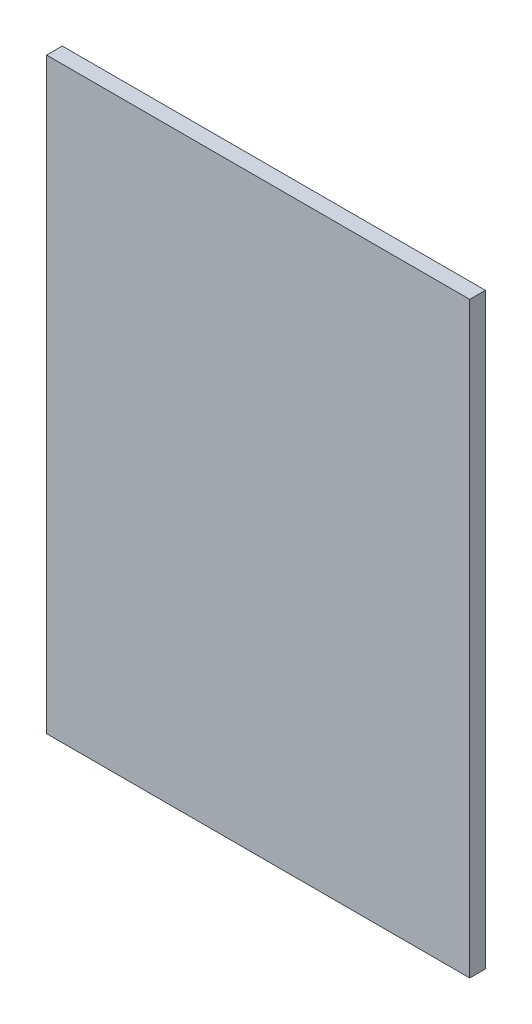
ISO-10303-21;
HEADER;
FILE_DESCRIPTION(('STEP AP214'),'2;1');
FILE_NAME('part.step','',(''),(''),'','','');
FILE_SCHEMA(('AUTOMOTIVE_DESIGN { 1 0 10303 214 1 1 1 1 }'));
ENDSEC;
DATA;
#1=APPLICATION_CONTEXT('core data for automotive mechanical design processes');
#2=APPLICATION_PROTOCOL_DEFINITION('international standard','automotive_design',2000,#1);
#3=PRODUCT_CONTEXT('',#1,'mechanical');
#4=PRODUCT('Part','Part','',(#3));
#5=PRODUCT_RELATED_PRODUCT_CATEGORY('part','',(#4));
#6=PRODUCT_DEFINITION_FORMATION('','',#4);
#7=PRODUCT_DEFINITION_CONTEXT('part definition',#1,'design');
#8=PRODUCT_DEFINITION('design','',#6,#7);
#9=PRODUCT_DEFINITION_SHAPE('','',#8);
#10=(LENGTH_UNIT() NAMED_UNIT(*) SI_UNIT(.MILLI.,.METRE.));
#11=(NAMED_UNIT(*) PLANE_ANGLE_UNIT() SI_UNIT($,.RADIAN.));
#12=(NAMED_UNIT(*) SI_UNIT($,.STERADIAN.) SOLID_ANGLE_UNIT());
#13=UNCERTAINTY_MEASURE_WITH_UNIT(LENGTH_MEASURE(1.E-05),#10,'distance_accuracy_value','');
#14=(GEOMETRIC_REPRESENTATION_CONTEXT(3) GLOBAL_UNCERTAINTY_ASSIGNED_CONTEXT((#13)) GLOBAL_UNIT_ASSIGNED_CONTEXT((#10,
#11,#12)) REPRESENTATION_CONTEXT('',''));
#15=CARTESIAN_POINT('',(0.,0.,0.));
#16=DIRECTION('',(0.,0.,1.));
#17=DIRECTION('',(1.,0.,0.));
#18=AXIS2_PLACEMENT_3D('',#15,#16,#17);
#19=CARTESIAN_POINT('',(-47.6546762589929,112.025179856115,4.));
#20=DIRECTION('',(1.,0.,0.));
#21=DIRECTION('',(0.,1.,0.));
#22=AXIS2_PLACEMENT_3D('',#19,#20,#21);
#23=PLANE('',#22);
#24=DIRECTION('',(0.,-1.,0.));
#25=VECTOR('',#24,1.);
#26=CARTESIAN_POINT('',(-47.6546762589929,112.025179856115,0.));
#27=LINE('',#26,#25);
#28=CARTESIAN_POINT('',(-47.6546762589929,112.025179856115,0.));
#29=VERTEX_POINT('',#28);
#30=CARTESIAN_POINT('',(-47.6546762589928,-37.9748201438849,0.));
#31=VERTEX_POINT('',#30);
#32=EDGE_CURVE('E95',#29,#31,#27,.T.);
#33=ORIENTED_EDGE('',*,*,#32,.T.);
#34=DIRECTION('',(0.,0.,-1.));
#35=VECTOR('',#34,1.);
#36=CARTESIAN_POINT('',(-47.6546762589928,-37.9748201438849,4.));
#37=LINE('',#36,#35);
#38=CARTESIAN_POINT('',(-47.6546762589928,-37.9748201438849,4.));
#39=VERTEX_POINT('',#38);
#40=EDGE_CURVE('E11',#39,#31,#37,.T.);
#41=ORIENTED_EDGE('',*,*,#40,.F.);
#42=DIRECTION('',(0.,-1.,0.));
#43=VECTOR('',#42,1.);
#44=CARTESIAN_POINT('',(-47.6546762589929,112.025179856115,4.));
#45=LINE('',#44,#43);
#46=CARTESIAN_POINT('',(-47.6546762589929,112.025179856115,4.));
#47=VERTEX_POINT('',#46);
#48=EDGE_CURVE('E83',#47,#39,#45,.T.);
#49=ORIENTED_EDGE('',*,*,#48,.F.);
#50=DIRECTION('',(0.,0.,-1.));
#51=VECTOR('',#50,1.);
#52=CARTESIAN_POINT('',(-47.6546762589929,112.025179856115,4.));
#53=LINE('',#52,#51);
#54=EDGE_CURVE('E91',#47,#29,#53,.T.);
#55=ORIENTED_EDGE('',*,*,#54,.T.);
#56=EDGE_LOOP('',(#33,#41,#49,#55));
#57=FACE_BOUND('',#56,.T.);
#58=ADVANCED_FACE('F32',(#57),#23,.F.);
#59=CARTESIAN_POINT('',(-47.6546762589928,-37.9748201438849,4.));
#60=DIRECTION('',(0.,1.,0.));
#61=DIRECTION('',(0.,0.,1.));
#62=AXIS2_PLACEMENT_3D('',#59,#60,#61);
#63=PLANE('',#62);
#64=DIRECTION('',(1.,0.,0.));
#65=VECTOR('',#64,1.);
#66=CARTESIAN_POINT('',(-47.6546762589928,-37.9748201438849,0.));
#67=LINE('',#66,#65);
#68=CARTESIAN_POINT('',(60.3453237410072,-37.9748201438849,0.));
#69=VERTEX_POINT('',#68);
#70=EDGE_CURVE('E87',#31,#69,#67,.T.);
#71=ORIENTED_EDGE('',*,*,#70,.T.);
#72=DIRECTION('',(0.,0.,-1.));
#73=VECTOR('',#72,1.);
#74=CARTESIAN_POINT('',(60.3453237410072,-37.9748201438849,4.));
#75=LINE('',#74,#73);
#76=CARTESIAN_POINT('',(60.3453237410072,-37.9748201438849,4.));
#77=VERTEX_POINT('',#76);
#78=EDGE_CURVE('E40',#77,#69,#75,.T.);
#79=ORIENTED_EDGE('',*,*,#78,.F.);
#80=DIRECTION('',(1.,0.,0.));
#81=VECTOR('',#80,1.);
#82=CARTESIAN_POINT('',(-47.6546762589928,-37.9748201438849,4.));
#83=LINE('',#82,#81);
#84=EDGE_CURVE('E78',#39,#77,#83,.T.);
#85=ORIENTED_EDGE('',*,*,#84,.F.);
#86=ORIENTED_EDGE('',*,*,#40,.T.);
#87=EDGE_LOOP('',(#71,#79,#85,#86));
#88=FACE_BOUND('',#87,.T.);
#89=ADVANCED_FACE('F86',(#88),#63,.F.);
#90=CARTESIAN_POINT('',(60.3453237410071,112.025179856115,4.));
#91=DIRECTION('',(-1.,0.,0.));
#92=DIRECTION('',(0.,-1.,0.));
#93=AXIS2_PLACEMENT_3D('',#90,#91,#92);
#94=PLANE('',#93);
#95=DIRECTION('',(0.,1.,0.));
#96=VECTOR('',#95,1.);
#97=CARTESIAN_POINT('',(60.3453237410071,112.025179856115,0.));
#98=LINE('',#97,#96);
#99=CARTESIAN_POINT('',(60.3453237410071,112.025179856115,0.));
#100=VERTEX_POINT('',#99);
#101=EDGE_CURVE('E65',#69,#100,#98,.T.);
#102=ORIENTED_EDGE('',*,*,#101,.T.);
#103=DIRECTION('',(0.,0.,-1.));
#104=VECTOR('',#103,1.);
#105=CARTESIAN_POINT('',(60.3453237410071,112.025179856115,4.));
#106=LINE('',#105,#104);
#107=CARTESIAN_POINT('',(60.3453237410071,112.025179856115,4.));
#108=VERTEX_POINT('',#107);
#109=EDGE_CURVE('E88',#108,#100,#106,.T.);
#110=ORIENTED_EDGE('',*,*,#109,.F.);
#111=DIRECTION('',(0.,1.,0.));
#112=VECTOR('',#111,1.);
#113=CARTESIAN_POINT('',(60.3453237410071,112.025179856115,4.));
#114=LINE('',#113,#112);
#115=EDGE_CURVE('E81',#77,#108,#114,.T.);
#116=ORIENTED_EDGE('',*,*,#115,.F.);
#117=ORIENTED_EDGE('',*,*,#78,.T.);
#118=EDGE_LOOP('',(#102,#110,#116,#117));
#119=FACE_BOUND('',#118,.T.);
#120=ADVANCED_FACE('F89',(#119),#94,.F.);
#121=CARTESIAN_POINT('',(-47.6546762589929,112.025179856115,4.));
#122=DIRECTION('',(0.,-1.,0.));
#123=DIRECTION('',(0.,0.,-1.));
#124=AXIS2_PLACEMENT_3D('',#121,#122,#123);
#125=PLANE('',#124);
#126=DIRECTION('',(-1.,0.,0.));
#127=VECTOR('',#126,1.);
#128=CARTESIAN_POINT('',(-47.6546762589929,112.025179856115,0.));
#129=LINE('',#128,#127);
#130=EDGE_CURVE('E71',#100,#29,#129,.T.);
#131=ORIENTED_EDGE('',*,*,#130,.T.);
#132=ORIENTED_EDGE('',*,*,#54,.F.);
#133=DIRECTION('',(-1.,0.,0.));
#134=VECTOR('',#133,1.);
#135=CARTESIAN_POINT('',(-47.6546762589929,112.025179856115,4.));
#136=LINE('',#135,#134);
#137=EDGE_CURVE('E48',#108,#47,#136,.T.);
#138=ORIENTED_EDGE('',*,*,#137,.F.);
#139=ORIENTED_EDGE('',*,*,#109,.T.);
#140=EDGE_LOOP('',(#131,#132,#138,#139));
#141=FACE_BOUND('',#140,.T.);
#142=ADVANCED_FACE('F102',(#141),#125,.F.);
#143=CARTESIAN_POINT('',(0.,0.,4.));
#144=DIRECTION('',(0.,0.,1.));
#145=DIRECTION('',(1.,0.,0.));
#146=AXIS2_PLACEMENT_3D('',#143,#144,#145);
#147=PLANE('',#146);
#148=ORIENTED_EDGE('',*,*,#48,.T.);
#149=ORIENTED_EDGE('',*,*,#84,.T.);
#150=ORIENTED_EDGE('',*,*,#115,.T.);
#151=ORIENTED_EDGE('',*,*,#137,.T.);
#152=EDGE_LOOP('',(#148,#149,#150,#151));
#153=FACE_BOUND('',#152,.T.);
#154=ADVANCED_FACE('F79',(#153),#147,.T.);
#155=CARTESIAN_POINT('',(0.,0.,0.));
#156=DIRECTION('',(0.,0.,1.));
#157=DIRECTION('',(1.,0.,0.));
#158=AXIS2_PLACEMENT_3D('',#155,#156,#157);
#159=PLANE('',#158);
#160=ORIENTED_EDGE('',*,*,#32,.F.);
#161=ORIENTED_EDGE('',*,*,#130,.F.);
#162=ORIENTED_EDGE('',*,*,#101,.F.);
#163=ORIENTED_EDGE('',*,*,#70,.F.);
#164=EDGE_LOOP('',(#160,#161,#162,#163));
#165=FACE_BOUND('',#164,.T.);
#166=ADVANCED_FACE('F105',(#165),#159,.F.);
#167=CLOSED_SHELL('',(#58,#89,#120,#142,#154,#166));
#168=MANIFOLD_SOLID_BREP('B2',#167);
#169=ADVANCED_BREP_SHAPE_REPRESENTATION('',(#18,#168),#14);
#170=SHAPE_DEFINITION_REPRESENTATION(#9,#169);
ENDSEC;
END-ISO-10303-21;
